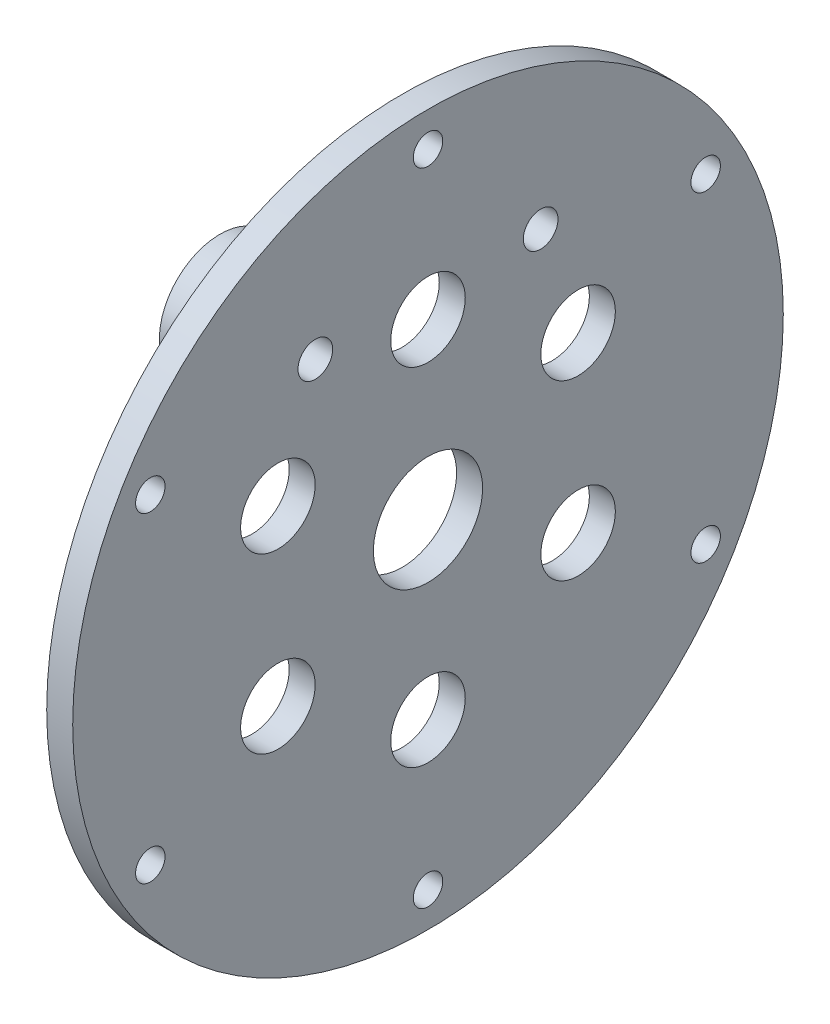
ISO-10303-21;
HEADER;
FILE_DESCRIPTION(('STEP AP214'),'2;1');
FILE_NAME('part.step','',(''),(''),'','','');
FILE_SCHEMA(('AUTOMOTIVE_DESIGN { 1 0 10303 214 1 1 1 1 }'));
ENDSEC;
DATA;
#1=APPLICATION_CONTEXT('core data for automotive mechanical design processes');
#2=APPLICATION_PROTOCOL_DEFINITION('international standard','automotive_design',2000,#1);
#3=PRODUCT_CONTEXT('',#1,'mechanical');
#4=PRODUCT('Part','Part','',(#3));
#5=PRODUCT_RELATED_PRODUCT_CATEGORY('part','',(#4));
#6=PRODUCT_DEFINITION_FORMATION('','',#4);
#7=PRODUCT_DEFINITION_CONTEXT('part definition',#1,'design');
#8=PRODUCT_DEFINITION('design','',#6,#7);
#9=PRODUCT_DEFINITION_SHAPE('','',#8);
#10=(LENGTH_UNIT() NAMED_UNIT(*) SI_UNIT(.MILLI.,.METRE.));
#11=(NAMED_UNIT(*) PLANE_ANGLE_UNIT() SI_UNIT($,.RADIAN.));
#12=(NAMED_UNIT(*) SI_UNIT($,.STERADIAN.) SOLID_ANGLE_UNIT());
#13=UNCERTAINTY_MEASURE_WITH_UNIT(LENGTH_MEASURE(1.E-05),#10,'distance_accuracy_value','');
#14=(GEOMETRIC_REPRESENTATION_CONTEXT(3) GLOBAL_UNCERTAINTY_ASSIGNED_CONTEXT((#13)) GLOBAL_UNIT_ASSIGNED_CONTEXT((#10,
#11,#12)) REPRESENTATION_CONTEXT('',''));
#15=CARTESIAN_POINT('',(0.,0.,0.));
#16=DIRECTION('',(0.,0.,1.));
#17=DIRECTION('',(1.,0.,0.));
#18=AXIS2_PLACEMENT_3D('',#15,#16,#17);
#19=CARTESIAN_POINT('',(-3.,41.,0.));
#20=DIRECTION('',(1.,0.,0.));
#21=DIRECTION('',(0.,0.,-1.));
#22=AXIS2_PLACEMENT_3D('',#19,#20,#21);
#23=PLANE('',#22);
#24=CARTESIAN_POINT('',(-3.,37.,0.));
#25=DIRECTION('',(1.,0.,0.));
#26=DIRECTION('',(0.,0.,-1.));
#27=AXIS2_PLACEMENT_3D('',#24,#25,#26);
#28=CIRCLE('',#27,1.7);
#29=CARTESIAN_POINT('',(-3.,37.,-1.7));
#30=VERTEX_POINT('',#29);
#31=EDGE_CURVE('E96',#30,#30,#28,.T.);
#32=ORIENTED_EDGE('',*,*,#31,.T.);
#33=EDGE_LOOP('',(#32));
#34=FACE_BOUND('',#33,.T.);
#35=CARTESIAN_POINT('',(-3.,18.5,-32.0429399400242));
#36=DIRECTION('',(1.,0.,0.));
#37=DIRECTION('',(0.,0.,-1.));
#38=AXIS2_PLACEMENT_3D('',#35,#36,#37);
#39=CIRCLE('',#38,1.7);
#40=CARTESIAN_POINT('',(-3.,18.5,-33.7429399400242));
#41=VERTEX_POINT('',#40);
#42=EDGE_CURVE('E80',#41,#41,#39,.T.);
#43=ORIENTED_EDGE('',*,*,#42,.T.);
#44=EDGE_LOOP('',(#43));
#45=FACE_BOUND('',#44,.T.);
#46=CARTESIAN_POINT('',(-3.,-18.5,-32.0429399400242));
#47=DIRECTION('',(1.,0.,0.));
#48=DIRECTION('',(0.,0.,-1.));
#49=AXIS2_PLACEMENT_3D('',#46,#47,#48);
#50=CIRCLE('',#49,1.7);
#51=CARTESIAN_POINT('',(-3.,-18.5,-33.7429399400242));
#52=VERTEX_POINT('',#51);
#53=EDGE_CURVE('E105',#52,#52,#50,.T.);
#54=ORIENTED_EDGE('',*,*,#53,.T.);
#55=EDGE_LOOP('',(#54));
#56=FACE_BOUND('',#55,.T.);
#57=CARTESIAN_POINT('',(-3.,-37.,0.));
#58=DIRECTION('',(1.,0.,0.));
#59=DIRECTION('',(0.,0.,-1.));
#60=AXIS2_PLACEMENT_3D('',#57,#58,#59);
#61=CIRCLE('',#60,1.7);
#62=CARTESIAN_POINT('',(-3.,-37.,-1.7));
#63=VERTEX_POINT('',#62);
#64=EDGE_CURVE('E125',#63,#63,#61,.T.);
#65=ORIENTED_EDGE('',*,*,#64,.T.);
#66=EDGE_LOOP('',(#65));
#67=FACE_BOUND('',#66,.T.);
#68=CARTESIAN_POINT('',(-3.,-18.5,32.0429399400242));
#69=DIRECTION('',(1.,0.,0.));
#70=DIRECTION('',(0.,0.,-1.));
#71=AXIS2_PLACEMENT_3D('',#68,#69,#70);
#72=CIRCLE('',#71,1.7);
#73=CARTESIAN_POINT('',(-3.,-18.5,30.3429399400242));
#74=VERTEX_POINT('',#73);
#75=EDGE_CURVE('E119',#74,#74,#72,.T.);
#76=ORIENTED_EDGE('',*,*,#75,.T.);
#77=EDGE_LOOP('',(#76));
#78=FACE_BOUND('',#77,.T.);
#79=CARTESIAN_POINT('',(-3.,18.5,32.0429399400242));
#80=DIRECTION('',(1.,0.,0.));
#81=DIRECTION('',(0.,0.,-1.));
#82=AXIS2_PLACEMENT_3D('',#79,#80,#81);
#83=CIRCLE('',#82,1.7);
#84=CARTESIAN_POINT('',(-3.,18.5,30.3429399400242));
#85=VERTEX_POINT('',#84);
#86=EDGE_CURVE('E111',#85,#85,#83,.T.);
#87=ORIENTED_EDGE('',*,*,#86,.T.);
#88=EDGE_LOOP('',(#87));
#89=FACE_BOUND('',#88,.T.);
#90=CARTESIAN_POINT('',(-3.,10.,-17.3205080756888));
#91=DIRECTION('',(1.,0.,0.));
#92=DIRECTION('',(0.,0.,-1.));
#93=AXIS2_PLACEMENT_3D('',#90,#91,#92);
#94=CIRCLE('',#93,4.3);
#95=CARTESIAN_POINT('',(-3.,10.,-21.6205080756888));
#96=VERTEX_POINT('',#95);
#97=EDGE_CURVE('E95',#96,#96,#94,.T.);
#98=ORIENTED_EDGE('',*,*,#97,.T.);
#99=EDGE_LOOP('',(#98));
#100=FACE_BOUND('',#99,.T.);
#101=CARTESIAN_POINT('',(-3.,-10.,-17.3205080756888));
#102=DIRECTION('',(1.,0.,0.));
#103=DIRECTION('',(0.,0.,-1.));
#104=AXIS2_PLACEMENT_3D('',#101,#102,#103);
#105=CIRCLE('',#104,4.3);
#106=CARTESIAN_POINT('',(-3.,-10.,-21.6205080756888));
#107=VERTEX_POINT('',#106);
#108=EDGE_CURVE('E173',#107,#107,#105,.T.);
#109=ORIENTED_EDGE('',*,*,#108,.T.);
#110=EDGE_LOOP('',(#109));
#111=FACE_BOUND('',#110,.T.);
#112=CARTESIAN_POINT('',(-3.,-20.,0.));
#113=DIRECTION('',(1.,0.,0.));
#114=DIRECTION('',(0.,0.,-1.));
#115=AXIS2_PLACEMENT_3D('',#112,#113,#114);
#116=CIRCLE('',#115,4.3);
#117=CARTESIAN_POINT('',(-3.,-20.,-4.3));
#118=VERTEX_POINT('',#117);
#119=EDGE_CURVE('E165',#118,#118,#116,.T.);
#120=ORIENTED_EDGE('',*,*,#119,.T.);
#121=EDGE_LOOP('',(#120));
#122=FACE_BOUND('',#121,.T.);
#123=CARTESIAN_POINT('',(-3.,-10.,17.3205080756888));
#124=DIRECTION('',(1.,0.,0.));
#125=DIRECTION('',(0.,0.,-1.));
#126=AXIS2_PLACEMENT_3D('',#123,#124,#125);
#127=CIRCLE('',#126,4.3);
#128=CARTESIAN_POINT('',(-3.,-10.,13.0205080756888));
#129=VERTEX_POINT('',#128);
#130=EDGE_CURVE('E157',#129,#129,#127,.T.);
#131=ORIENTED_EDGE('',*,*,#130,.T.);
#132=EDGE_LOOP('',(#131));
#133=FACE_BOUND('',#132,.T.);
#134=CARTESIAN_POINT('',(-3.,10.,17.3205080756888));
#135=DIRECTION('',(1.,0.,0.));
#136=DIRECTION('',(0.,0.,-1.));
#137=AXIS2_PLACEMENT_3D('',#134,#135,#136);
#138=CIRCLE('',#137,4.3);
#139=CARTESIAN_POINT('',(-3.,10.,13.0205080756888));
#140=VERTEX_POINT('',#139);
#141=EDGE_CURVE('E149',#140,#140,#138,.T.);
#142=ORIENTED_EDGE('',*,*,#141,.T.);
#143=EDGE_LOOP('',(#142));
#144=FACE_BOUND('',#143,.T.);
#145=CARTESIAN_POINT('',(-3.,20.,0.));
#146=DIRECTION('',(1.,0.,0.));
#147=DIRECTION('',(0.,0.,-1.));
#148=AXIS2_PLACEMENT_3D('',#145,#146,#147);
#149=CIRCLE('',#148,4.3);
#150=CARTESIAN_POINT('',(-3.,20.,-4.3));
#151=VERTEX_POINT('',#150);
#152=EDGE_CURVE('E141',#151,#151,#149,.T.);
#153=ORIENTED_EDGE('',*,*,#152,.T.);
#154=EDGE_LOOP('',(#153));
#155=FACE_BOUND('',#154,.T.);
#156=CARTESIAN_POINT('',(-3.,0.,0.));
#157=DIRECTION('',(1.,0.,0.));
#158=DIRECTION('',(0.,0.,-1.));
#159=AXIS2_PLACEMENT_3D('',#156,#157,#158);
#160=CIRCLE('',#159,6.3);
#161=CARTESIAN_POINT('',(-3.,0.,-6.3));
#162=VERTEX_POINT('',#161);
#163=EDGE_CURVE('E140',#162,#162,#160,.T.);
#164=ORIENTED_EDGE('',*,*,#163,.T.);
#165=EDGE_LOOP('',(#164));
#166=FACE_BOUND('',#165,.T.);
#167=CARTESIAN_POINT('',(-3.,22.5166604983954,-13.));
#168=DIRECTION('',(1.,0.,0.));
#169=DIRECTION('',(0.,0.,-1.));
#170=AXIS2_PLACEMENT_3D('',#167,#168,#169);
#171=CIRCLE('',#170,7.);
#172=CARTESIAN_POINT('',(-3.,22.5166604983954,-20.));
#173=VERTEX_POINT('',#172);
#174=EDGE_CURVE('E10',#173,#173,#171,.F.);
#175=ORIENTED_EDGE('',*,*,#174,.F.);
#176=EDGE_LOOP('',(#175));
#177=FACE_BOUND('',#176,.T.);
#178=CARTESIAN_POINT('',(-3.,22.5166604983954,13.));
#179=DIRECTION('',(1.,0.,0.));
#180=DIRECTION('',(0.,0.,-1.));
#181=AXIS2_PLACEMENT_3D('',#178,#179,#180);
#182=CIRCLE('',#181,7.);
#183=CARTESIAN_POINT('',(-3.,22.5166604983954,6.));
#184=VERTEX_POINT('',#183);
#185=EDGE_CURVE('E43',#184,#184,#182,.F.);
#186=ORIENTED_EDGE('',*,*,#185,.F.);
#187=EDGE_LOOP('',(#186));
#188=FACE_BOUND('',#187,.T.);
#189=CARTESIAN_POINT('',(-3.,0.,0.));
#190=DIRECTION('',(-1.,0.,0.));
#191=DIRECTION('',(0.,0.,1.));
#192=AXIS2_PLACEMENT_3D('',#189,#190,#191);
#193=CIRCLE('',#192,41.);
#194=CARTESIAN_POINT('',(-3.,0.,41.));
#195=VERTEX_POINT('',#194);
#196=EDGE_CURVE('E198',#195,#195,#193,.T.);
#197=ORIENTED_EDGE('',*,*,#196,.T.);
#198=EDGE_LOOP('',(#197));
#199=FACE_BOUND('',#198,.T.);
#200=ADVANCED_FACE('F35',(#34,#45,#56,#67,#78,#89,#100,#111,#122,#133,#144,#155,#166,#177,#188,
#199),#23,.F.);
#201=CARTESIAN_POINT('',(0.,0.,0.));
#202=DIRECTION('',(-1.,0.,0.));
#203=DIRECTION('',(0.,0.,1.));
#204=AXIS2_PLACEMENT_3D('',#201,#202,#203);
#205=PLANE('',#204);
#206=CARTESIAN_POINT('',(0.,22.5166604983954,13.));
#207=DIRECTION('',(1.,0.,0.));
#208=DIRECTION('',(0.,0.,-1.));
#209=AXIS2_PLACEMENT_3D('',#206,#207,#208);
#210=CIRCLE('',#209,2.);
#211=CARTESIAN_POINT('',(0.,22.5166604983954,11.));
#212=VERTEX_POINT('',#211);
#213=EDGE_CURVE('E57',#212,#212,#210,.T.);
#214=ORIENTED_EDGE('',*,*,#213,.F.);
#215=EDGE_LOOP('',(#214));
#216=FACE_BOUND('',#215,.T.);
#217=CARTESIAN_POINT('',(0.,22.5166604983954,-13.));
#218=DIRECTION('',(1.,0.,0.));
#219=DIRECTION('',(0.,0.,-1.));
#220=AXIS2_PLACEMENT_3D('',#217,#218,#219);
#221=CIRCLE('',#220,2.);
#222=CARTESIAN_POINT('',(0.,22.5166604983954,-15.));
#223=VERTEX_POINT('',#222);
#224=EDGE_CURVE('E66',#223,#223,#221,.T.);
#225=ORIENTED_EDGE('',*,*,#224,.F.);
#226=EDGE_LOOP('',(#225));
#227=FACE_BOUND('',#226,.T.);
#228=CARTESIAN_POINT('',(0.,37.,0.));
#229=DIRECTION('',(1.,0.,0.));
#230=DIRECTION('',(0.,0.,-1.));
#231=AXIS2_PLACEMENT_3D('',#228,#229,#230);
#232=CIRCLE('',#231,1.7);
#233=CARTESIAN_POINT('',(0.,37.,-1.7));
#234=VERTEX_POINT('',#233);
#235=EDGE_CURVE('E91',#234,#234,#232,.T.);
#236=ORIENTED_EDGE('',*,*,#235,.F.);
#237=EDGE_LOOP('',(#236));
#238=FACE_BOUND('',#237,.T.);
#239=CARTESIAN_POINT('',(0.,18.5,-32.0429399400242));
#240=DIRECTION('',(1.,0.,0.));
#241=DIRECTION('',(0.,0.,-1.));
#242=AXIS2_PLACEMENT_3D('',#239,#240,#241);
#243=CIRCLE('',#242,1.7);
#244=CARTESIAN_POINT('',(0.,18.5,-33.7429399400242));
#245=VERTEX_POINT('',#244);
#246=EDGE_CURVE('E101',#245,#245,#243,.T.);
#247=ORIENTED_EDGE('',*,*,#246,.F.);
#248=EDGE_LOOP('',(#247));
#249=FACE_BOUND('',#248,.T.);
#250=CARTESIAN_POINT('',(0.,-18.5,-32.0429399400242));
#251=DIRECTION('',(1.,0.,0.));
#252=DIRECTION('',(0.,0.,-1.));
#253=AXIS2_PLACEMENT_3D('',#250,#251,#252);
#254=CIRCLE('',#253,1.7);
#255=CARTESIAN_POINT('',(0.,-18.5,-33.7429399400242));
#256=VERTEX_POINT('',#255);
#257=EDGE_CURVE('E129',#256,#256,#254,.T.);
#258=ORIENTED_EDGE('',*,*,#257,.F.);
#259=EDGE_LOOP('',(#258));
#260=FACE_BOUND('',#259,.T.);
#261=CARTESIAN_POINT('',(0.,-37.,0.));
#262=DIRECTION('',(1.,0.,0.));
#263=DIRECTION('',(0.,0.,-1.));
#264=AXIS2_PLACEMENT_3D('',#261,#262,#263);
#265=CIRCLE('',#264,1.7);
#266=CARTESIAN_POINT('',(0.,-37.,-1.7));
#267=VERTEX_POINT('',#266);
#268=EDGE_CURVE('E122',#267,#267,#265,.T.);
#269=ORIENTED_EDGE('',*,*,#268,.F.);
#270=EDGE_LOOP('',(#269));
#271=FACE_BOUND('',#270,.T.);
#272=CARTESIAN_POINT('',(0.,-18.5,32.0429399400242));
#273=DIRECTION('',(1.,0.,0.));
#274=DIRECTION('',(0.,0.,-1.));
#275=AXIS2_PLACEMENT_3D('',#272,#273,#274);
#276=CIRCLE('',#275,1.7);
#277=CARTESIAN_POINT('',(0.,-18.5,30.3429399400242));
#278=VERTEX_POINT('',#277);
#279=EDGE_CURVE('E115',#278,#278,#276,.T.);
#280=ORIENTED_EDGE('',*,*,#279,.F.);
#281=EDGE_LOOP('',(#280));
#282=FACE_BOUND('',#281,.T.);
#283=CARTESIAN_POINT('',(0.,18.5,32.0429399400242));
#284=DIRECTION('',(1.,0.,0.));
#285=DIRECTION('',(0.,0.,-1.));
#286=AXIS2_PLACEMENT_3D('',#283,#284,#285);
#287=CIRCLE('',#286,1.7);
#288=CARTESIAN_POINT('',(0.,18.5,30.3429399400242));
#289=VERTEX_POINT('',#288);
#290=EDGE_CURVE('E100',#289,#289,#287,.T.);
#291=ORIENTED_EDGE('',*,*,#290,.F.);
#292=EDGE_LOOP('',(#291));
#293=FACE_BOUND('',#292,.T.);
#294=CARTESIAN_POINT('',(0.,10.,-17.3205080756888));
#295=DIRECTION('',(1.,0.,0.));
#296=DIRECTION('',(0.,0.,-1.));
#297=AXIS2_PLACEMENT_3D('',#294,#295,#296);
#298=CIRCLE('',#297,4.3);
#299=CARTESIAN_POINT('',(0.,10.,-21.6205080756888));
#300=VERTEX_POINT('',#299);
#301=EDGE_CURVE('E177',#300,#300,#298,.T.);
#302=ORIENTED_EDGE('',*,*,#301,.F.);
#303=EDGE_LOOP('',(#302));
#304=FACE_BOUND('',#303,.T.);
#305=CARTESIAN_POINT('',(0.,-10.,-17.3205080756888));
#306=DIRECTION('',(1.,0.,0.));
#307=DIRECTION('',(0.,0.,-1.));
#308=AXIS2_PLACEMENT_3D('',#305,#306,#307);
#309=CIRCLE('',#308,4.3);
#310=CARTESIAN_POINT('',(0.,-10.,-21.6205080756888));
#311=VERTEX_POINT('',#310);
#312=EDGE_CURVE('E169',#311,#311,#309,.T.);
#313=ORIENTED_EDGE('',*,*,#312,.F.);
#314=EDGE_LOOP('',(#313));
#315=FACE_BOUND('',#314,.T.);
#316=CARTESIAN_POINT('',(0.,-20.,0.));
#317=DIRECTION('',(1.,0.,0.));
#318=DIRECTION('',(0.,0.,-1.));
#319=AXIS2_PLACEMENT_3D('',#316,#317,#318);
#320=CIRCLE('',#319,4.3);
#321=CARTESIAN_POINT('',(0.,-20.,-4.3));
#322=VERTEX_POINT('',#321);
#323=EDGE_CURVE('E161',#322,#322,#320,.T.);
#324=ORIENTED_EDGE('',*,*,#323,.F.);
#325=EDGE_LOOP('',(#324));
#326=FACE_BOUND('',#325,.T.);
#327=CARTESIAN_POINT('',(0.,-10.,17.3205080756888));
#328=DIRECTION('',(1.,0.,0.));
#329=DIRECTION('',(0.,0.,-1.));
#330=AXIS2_PLACEMENT_3D('',#327,#328,#329);
#331=CIRCLE('',#330,4.3);
#332=CARTESIAN_POINT('',(0.,-10.,13.0205080756888));
#333=VERTEX_POINT('',#332);
#334=EDGE_CURVE('E153',#333,#333,#331,.T.);
#335=ORIENTED_EDGE('',*,*,#334,.F.);
#336=EDGE_LOOP('',(#335));
#337=FACE_BOUND('',#336,.T.);
#338=CARTESIAN_POINT('',(0.,10.,17.3205080756888));
#339=DIRECTION('',(1.,0.,0.));
#340=DIRECTION('',(0.,0.,-1.));
#341=AXIS2_PLACEMENT_3D('',#338,#339,#340);
#342=CIRCLE('',#341,4.3);
#343=CARTESIAN_POINT('',(0.,10.,13.0205080756888));
#344=VERTEX_POINT('',#343);
#345=EDGE_CURVE('E145',#344,#344,#342,.T.);
#346=ORIENTED_EDGE('',*,*,#345,.F.);
#347=EDGE_LOOP('',(#346));
#348=FACE_BOUND('',#347,.T.);
#349=CARTESIAN_POINT('',(0.,20.,0.));
#350=DIRECTION('',(1.,0.,0.));
#351=DIRECTION('',(0.,0.,-1.));
#352=AXIS2_PLACEMENT_3D('',#349,#350,#351);
#353=CIRCLE('',#352,4.3);
#354=CARTESIAN_POINT('',(0.,20.,-4.3));
#355=VERTEX_POINT('',#354);
#356=EDGE_CURVE('E136',#355,#355,#353,.T.);
#357=ORIENTED_EDGE('',*,*,#356,.F.);
#358=EDGE_LOOP('',(#357));
#359=FACE_BOUND('',#358,.T.);
#360=CARTESIAN_POINT('',(0.,0.,0.));
#361=DIRECTION('',(1.,0.,0.));
#362=DIRECTION('',(0.,0.,-1.));
#363=AXIS2_PLACEMENT_3D('',#360,#361,#362);
#364=CIRCLE('',#363,6.3);
#365=CARTESIAN_POINT('',(0.,0.,-6.3));
#366=VERTEX_POINT('',#365);
#367=EDGE_CURVE('E184',#366,#366,#364,.T.);
#368=ORIENTED_EDGE('',*,*,#367,.F.);
#369=EDGE_LOOP('',(#368));
#370=FACE_BOUND('',#369,.T.);
#371=CARTESIAN_POINT('',(0.,0.,0.));
#372=DIRECTION('',(-1.,0.,0.));
#373=DIRECTION('',(0.,0.,1.));
#374=AXIS2_PLACEMENT_3D('',#371,#372,#373);
#375=CIRCLE('',#374,41.);
#376=CARTESIAN_POINT('',(0.,0.,41.));
#377=VERTEX_POINT('',#376);
#378=EDGE_CURVE('E51',#377,#377,#375,.T.);
#379=ORIENTED_EDGE('',*,*,#378,.F.);
#380=EDGE_LOOP('',(#379));
#381=FACE_BOUND('',#380,.T.);
#382=ADVANCED_FACE('F207',(#216,#227,#238,#249,#260,#271,#282,#293,#304,#315,#326,#337,#348,
#359,#370,#381),#205,.F.);
#383=CARTESIAN_POINT('',(-60.,0.,0.));
#384=DIRECTION('',(-1.,0.,0.));
#385=DIRECTION('',(0.,0.,1.));
#386=AXIS2_PLACEMENT_3D('',#383,#384,#385);
#387=CYLINDRICAL_SURFACE('',#386,41.);
#388=ORIENTED_EDGE('',*,*,#196,.F.);
#389=EDGE_LOOP('',(#388));
#390=FACE_BOUND('',#389,.T.);
#391=ORIENTED_EDGE('',*,*,#378,.T.);
#392=EDGE_LOOP('',(#391));
#393=FACE_BOUND('',#392,.T.);
#394=ADVANCED_FACE('F205',(#390,#393),#387,.T.);
#395=CARTESIAN_POINT('',(-3.,22.5166604983954,13.));
#396=DIRECTION('',(-1.,0.,0.));
#397=DIRECTION('',(0.,0.,1.));
#398=AXIS2_PLACEMENT_3D('',#395,#396,#397);
#399=CYLINDRICAL_SURFACE('',#398,7.);
#400=ORIENTED_EDGE('',*,*,#185,.T.);
#401=EDGE_LOOP('',(#400));
#402=FACE_BOUND('',#401,.T.);
#403=CARTESIAN_POINT('',(-11.,22.5166604983954,13.));
#404=DIRECTION('',(1.,0.,0.));
#405=DIRECTION('',(0.,0.,-1.));
#406=AXIS2_PLACEMENT_3D('',#403,#404,#405);
#407=CIRCLE('',#406,7.);
#408=CARTESIAN_POINT('',(-11.,22.5166604983954,6.));
#409=VERTEX_POINT('',#408);
#410=EDGE_CURVE('E195',#409,#409,#407,.T.);
#411=ORIENTED_EDGE('',*,*,#410,.T.);
#412=EDGE_LOOP('',(#411));
#413=FACE_BOUND('',#412,.T.);
#414=ADVANCED_FACE('F214',(#402,#413),#399,.T.);
#415=CARTESIAN_POINT('',(-11.,22.5166604983954,13.));
#416=DIRECTION('',(1.,0.,0.));
#417=DIRECTION('',(0.,0.,-1.));
#418=AXIS2_PLACEMENT_3D('',#415,#416,#417);
#419=PLANE('',#418);
#420=CARTESIAN_POINT('',(-11.,22.5166604983954,13.));
#421=DIRECTION('',(1.,0.,0.));
#422=DIRECTION('',(0.,0.,-1.));
#423=AXIS2_PLACEMENT_3D('',#420,#421,#422);
#424=CIRCLE('',#423,4.4);
#425=CARTESIAN_POINT('',(-11.,22.5166604983954,8.6));
#426=VERTEX_POINT('',#425);
#427=EDGE_CURVE('E81',#426,#426,#424,.T.);
#428=ORIENTED_EDGE('',*,*,#427,.T.);
#429=EDGE_LOOP('',(#428));
#430=FACE_BOUND('',#429,.T.);
#431=ORIENTED_EDGE('',*,*,#410,.F.);
#432=EDGE_LOOP('',(#431));
#433=FACE_BOUND('',#432,.T.);
#434=ADVANCED_FACE('F222',(#430,#433),#419,.F.);
#435=CARTESIAN_POINT('',(-3.,22.5166604983954,-13.));
#436=DIRECTION('',(-1.,0.,0.));
#437=DIRECTION('',(0.,0.,1.));
#438=AXIS2_PLACEMENT_3D('',#435,#436,#437);
#439=CYLINDRICAL_SURFACE('',#438,7.);
#440=ORIENTED_EDGE('',*,*,#174,.T.);
#441=EDGE_LOOP('',(#440));
#442=FACE_BOUND('',#441,.T.);
#443=CARTESIAN_POINT('',(-11.,22.5166604983954,-13.));
#444=DIRECTION('',(1.,0.,0.));
#445=DIRECTION('',(0.,0.,-1.));
#446=AXIS2_PLACEMENT_3D('',#443,#444,#445);
#447=CIRCLE('',#446,7.);
#448=CARTESIAN_POINT('',(-11.,22.5166604983954,-20.));
#449=VERTEX_POINT('',#448);
#450=EDGE_CURVE('E188',#449,#449,#447,.T.);
#451=ORIENTED_EDGE('',*,*,#450,.T.);
#452=EDGE_LOOP('',(#451));
#453=FACE_BOUND('',#452,.T.);
#454=ADVANCED_FACE('F226',(#442,#453),#439,.T.);
#455=CARTESIAN_POINT('',(-11.,22.5166604983954,-13.));
#456=DIRECTION('',(1.,0.,0.));
#457=DIRECTION('',(0.,0.,-1.));
#458=AXIS2_PLACEMENT_3D('',#455,#456,#457);
#459=PLANE('',#458);
#460=CARTESIAN_POINT('',(-11.,22.5166604983954,-13.));
#461=DIRECTION('',(1.,0.,0.));
#462=DIRECTION('',(0.,0.,-1.));
#463=AXIS2_PLACEMENT_3D('',#460,#461,#462);
#464=CIRCLE('',#463,4.4);
#465=CARTESIAN_POINT('',(-11.,22.5166604983954,-17.4));
#466=VERTEX_POINT('',#465);
#467=EDGE_CURVE('E63',#466,#466,#464,.T.);
#468=ORIENTED_EDGE('',*,*,#467,.T.);
#469=EDGE_LOOP('',(#468));
#470=FACE_BOUND('',#469,.T.);
#471=ORIENTED_EDGE('',*,*,#450,.F.);
#472=EDGE_LOOP('',(#471));
#473=FACE_BOUND('',#472,.T.);
#474=ADVANCED_FACE('F230',(#470,#473),#459,.F.);
#475=CARTESIAN_POINT('',(0.,0.,0.));
#476=DIRECTION('',(-1.,0.,0.));
#477=DIRECTION('',(0.,0.,1.));
#478=AXIS2_PLACEMENT_3D('',#475,#476,#477);
#479=CYLINDRICAL_SURFACE('',#478,6.3);
#480=ORIENTED_EDGE('',*,*,#367,.T.);
#481=EDGE_LOOP('',(#480));
#482=FACE_BOUND('',#481,.T.);
#483=ORIENTED_EDGE('',*,*,#163,.F.);
#484=EDGE_LOOP('',(#483));
#485=FACE_BOUND('',#484,.T.);
#486=ADVANCED_FACE('F233',(#482,#485),#479,.F.);
#487=CARTESIAN_POINT('',(0.,20.,0.));
#488=DIRECTION('',(-1.,0.,0.));
#489=DIRECTION('',(0.,0.,1.));
#490=AXIS2_PLACEMENT_3D('',#487,#488,#489);
#491=CYLINDRICAL_SURFACE('',#490,4.3);
#492=ORIENTED_EDGE('',*,*,#356,.T.);
#493=EDGE_LOOP('',(#492));
#494=FACE_BOUND('',#493,.T.);
#495=ORIENTED_EDGE('',*,*,#152,.F.);
#496=EDGE_LOOP('',(#495));
#497=FACE_BOUND('',#496,.T.);
#498=ADVANCED_FACE('F237',(#494,#497),#491,.F.);
#499=CARTESIAN_POINT('',(0.,10.,17.3205080756888));
#500=DIRECTION('',(-1.,0.,0.));
#501=DIRECTION('',(0.,0.,1.));
#502=AXIS2_PLACEMENT_3D('',#499,#500,#501);
#503=CYLINDRICAL_SURFACE('',#502,4.3);
#504=ORIENTED_EDGE('',*,*,#345,.T.);
#505=EDGE_LOOP('',(#504));
#506=FACE_BOUND('',#505,.T.);
#507=ORIENTED_EDGE('',*,*,#141,.F.);
#508=EDGE_LOOP('',(#507));
#509=FACE_BOUND('',#508,.T.);
#510=ADVANCED_FACE('F255',(#506,#509),#503,.F.);
#511=CARTESIAN_POINT('',(0.,-10.,17.3205080756888));
#512=DIRECTION('',(-1.,0.,0.));
#513=DIRECTION('',(0.,0.,1.));
#514=AXIS2_PLACEMENT_3D('',#511,#512,#513);
#515=CYLINDRICAL_SURFACE('',#514,4.3);
#516=ORIENTED_EDGE('',*,*,#334,.T.);
#517=EDGE_LOOP('',(#516));
#518=FACE_BOUND('',#517,.T.);
#519=ORIENTED_EDGE('',*,*,#130,.F.);
#520=EDGE_LOOP('',(#519));
#521=FACE_BOUND('',#520,.T.);
#522=ADVANCED_FACE('F251',(#518,#521),#515,.F.);
#523=CARTESIAN_POINT('',(0.,-20.,0.));
#524=DIRECTION('',(-1.,0.,0.));
#525=DIRECTION('',(0.,0.,1.));
#526=AXIS2_PLACEMENT_3D('',#523,#524,#525);
#527=CYLINDRICAL_SURFACE('',#526,4.3);
#528=ORIENTED_EDGE('',*,*,#323,.T.);
#529=EDGE_LOOP('',(#528));
#530=FACE_BOUND('',#529,.T.);
#531=ORIENTED_EDGE('',*,*,#119,.F.);
#532=EDGE_LOOP('',(#531));
#533=FACE_BOUND('',#532,.T.);
#534=ADVANCED_FACE('F247',(#530,#533),#527,.F.);
#535=CARTESIAN_POINT('',(0.,-10.,-17.3205080756888));
#536=DIRECTION('',(-1.,0.,0.));
#537=DIRECTION('',(0.,0.,1.));
#538=AXIS2_PLACEMENT_3D('',#535,#536,#537);
#539=CYLINDRICAL_SURFACE('',#538,4.3);
#540=ORIENTED_EDGE('',*,*,#312,.T.);
#541=EDGE_LOOP('',(#540));
#542=FACE_BOUND('',#541,.T.);
#543=ORIENTED_EDGE('',*,*,#108,.F.);
#544=EDGE_LOOP('',(#543));
#545=FACE_BOUND('',#544,.T.);
#546=ADVANCED_FACE('F243',(#542,#545),#539,.F.);
#547=CARTESIAN_POINT('',(0.,10.,-17.3205080756888));
#548=DIRECTION('',(-1.,0.,0.));
#549=DIRECTION('',(0.,0.,1.));
#550=AXIS2_PLACEMENT_3D('',#547,#548,#549);
#551=CYLINDRICAL_SURFACE('',#550,4.3);
#552=ORIENTED_EDGE('',*,*,#301,.T.);
#553=EDGE_LOOP('',(#552));
#554=FACE_BOUND('',#553,.T.);
#555=ORIENTED_EDGE('',*,*,#97,.F.);
#556=EDGE_LOOP('',(#555));
#557=FACE_BOUND('',#556,.T.);
#558=ADVANCED_FACE('F239',(#554,#557),#551,.F.);
#559=CARTESIAN_POINT('',(0.,18.5,32.0429399400242));
#560=DIRECTION('',(-1.,0.,0.));
#561=DIRECTION('',(0.,0.,1.));
#562=AXIS2_PLACEMENT_3D('',#559,#560,#561);
#563=CYLINDRICAL_SURFACE('',#562,1.7);
#564=ORIENTED_EDGE('',*,*,#290,.T.);
#565=EDGE_LOOP('',(#564));
#566=FACE_BOUND('',#565,.T.);
#567=ORIENTED_EDGE('',*,*,#86,.F.);
#568=EDGE_LOOP('',(#567));
#569=FACE_BOUND('',#568,.T.);
#570=ADVANCED_FACE('F242',(#566,#569),#563,.F.);
#571=CARTESIAN_POINT('',(0.,-18.5,32.0429399400242));
#572=DIRECTION('',(-1.,0.,0.));
#573=DIRECTION('',(0.,0.,1.));
#574=AXIS2_PLACEMENT_3D('',#571,#572,#573);
#575=CYLINDRICAL_SURFACE('',#574,1.7);
#576=ORIENTED_EDGE('',*,*,#279,.T.);
#577=EDGE_LOOP('',(#576));
#578=FACE_BOUND('',#577,.T.);
#579=ORIENTED_EDGE('',*,*,#75,.F.);
#580=EDGE_LOOP('',(#579));
#581=FACE_BOUND('',#580,.T.);
#582=ADVANCED_FACE('F271',(#578,#581),#575,.F.);
#583=CARTESIAN_POINT('',(0.,-37.,0.));
#584=DIRECTION('',(-1.,0.,0.));
#585=DIRECTION('',(0.,0.,1.));
#586=AXIS2_PLACEMENT_3D('',#583,#584,#585);
#587=CYLINDRICAL_SURFACE('',#586,1.7);
#588=ORIENTED_EDGE('',*,*,#268,.T.);
#589=EDGE_LOOP('',(#588));
#590=FACE_BOUND('',#589,.T.);
#591=ORIENTED_EDGE('',*,*,#64,.F.);
#592=EDGE_LOOP('',(#591));
#593=FACE_BOUND('',#592,.T.);
#594=ADVANCED_FACE('F267',(#590,#593),#587,.F.);
#595=CARTESIAN_POINT('',(0.,-18.5,-32.0429399400242));
#596=DIRECTION('',(-1.,0.,0.));
#597=DIRECTION('',(0.,0.,1.));
#598=AXIS2_PLACEMENT_3D('',#595,#596,#597);
#599=CYLINDRICAL_SURFACE('',#598,1.7);
#600=ORIENTED_EDGE('',*,*,#257,.T.);
#601=EDGE_LOOP('',(#600));
#602=FACE_BOUND('',#601,.T.);
#603=ORIENTED_EDGE('',*,*,#53,.F.);
#604=EDGE_LOOP('',(#603));
#605=FACE_BOUND('',#604,.T.);
#606=ADVANCED_FACE('F263',(#602,#605),#599,.F.);
#607=CARTESIAN_POINT('',(0.,18.5,-32.0429399400242));
#608=DIRECTION('',(-1.,0.,0.));
#609=DIRECTION('',(0.,0.,1.));
#610=AXIS2_PLACEMENT_3D('',#607,#608,#609);
#611=CYLINDRICAL_SURFACE('',#610,1.7);
#612=ORIENTED_EDGE('',*,*,#246,.T.);
#613=EDGE_LOOP('',(#612));
#614=FACE_BOUND('',#613,.T.);
#615=ORIENTED_EDGE('',*,*,#42,.F.);
#616=EDGE_LOOP('',(#615));
#617=FACE_BOUND('',#616,.T.);
#618=ADVANCED_FACE('F266',(#614,#617),#611,.F.);
#619=CARTESIAN_POINT('',(0.,37.,0.));
#620=DIRECTION('',(-1.,0.,0.));
#621=DIRECTION('',(0.,0.,1.));
#622=AXIS2_PLACEMENT_3D('',#619,#620,#621);
#623=CYLINDRICAL_SURFACE('',#622,1.7);
#624=ORIENTED_EDGE('',*,*,#235,.T.);
#625=EDGE_LOOP('',(#624));
#626=FACE_BOUND('',#625,.T.);
#627=ORIENTED_EDGE('',*,*,#31,.F.);
#628=EDGE_LOOP('',(#627));
#629=FACE_BOUND('',#628,.T.);
#630=ADVANCED_FACE('F281',(#626,#629),#623,.F.);
#631=CARTESIAN_POINT('',(-4.,22.5166604983954,-13.));
#632=DIRECTION('',(-1.,0.,0.));
#633=DIRECTION('',(0.,0.,1.));
#634=AXIS2_PLACEMENT_3D('',#631,#632,#633);
#635=CYLINDRICAL_SURFACE('',#634,4.4);
#636=CARTESIAN_POINT('',(-4.,22.5166604983954,-13.));
#637=DIRECTION('',(1.,0.,0.));
#638=DIRECTION('',(0.,0.,-1.));
#639=AXIS2_PLACEMENT_3D('',#636,#637,#638);
#640=CIRCLE('',#639,4.4);
#641=CARTESIAN_POINT('',(-4.,22.5166604983954,-17.4));
#642=VERTEX_POINT('',#641);
#643=EDGE_CURVE('E84',#642,#642,#640,.T.);
#644=ORIENTED_EDGE('',*,*,#643,.T.);
#645=EDGE_LOOP('',(#644));
#646=FACE_BOUND('',#645,.T.);
#647=ORIENTED_EDGE('',*,*,#467,.F.);
#648=EDGE_LOOP('',(#647));
#649=FACE_BOUND('',#648,.T.);
#650=ADVANCED_FACE('F285',(#646,#649),#635,.F.);
#651=CARTESIAN_POINT('',(-4.,22.5166604983954,-13.));
#652=DIRECTION('',(1.,0.,0.));
#653=DIRECTION('',(0.,0.,-1.));
#654=AXIS2_PLACEMENT_3D('',#651,#652,#653);
#655=PLANE('',#654);
#656=CARTESIAN_POINT('',(-4.,22.5166604983954,-13.));
#657=DIRECTION('',(1.,0.,0.));
#658=DIRECTION('',(0.,0.,-1.));
#659=AXIS2_PLACEMENT_3D('',#656,#657,#658);
#660=CIRCLE('',#659,2.);
#661=CARTESIAN_POINT('',(-4.,22.5166604983954,-15.));
#662=VERTEX_POINT('',#661);
#663=EDGE_CURVE('E38',#662,#662,#660,.F.);
#664=ORIENTED_EDGE('',*,*,#663,.F.);
#665=EDGE_LOOP('',(#664));
#666=FACE_BOUND('',#665,.T.);
#667=ORIENTED_EDGE('',*,*,#643,.F.);
#668=EDGE_LOOP('',(#667));
#669=FACE_BOUND('',#668,.T.);
#670=ADVANCED_FACE('F289',(#666,#669),#655,.F.);
#671=CARTESIAN_POINT('',(-4.,22.5166604983954,13.));
#672=DIRECTION('',(-1.,0.,0.));
#673=DIRECTION('',(0.,0.,1.));
#674=AXIS2_PLACEMENT_3D('',#671,#672,#673);
#675=CYLINDRICAL_SURFACE('',#674,4.4);
#676=CARTESIAN_POINT('',(-4.,22.5166604983954,13.));
#677=DIRECTION('',(1.,0.,0.));
#678=DIRECTION('',(0.,0.,-1.));
#679=AXIS2_PLACEMENT_3D('',#676,#677,#678);
#680=CIRCLE('',#679,4.4);
#681=CARTESIAN_POINT('',(-4.,22.5166604983954,8.6));
#682=VERTEX_POINT('',#681);
#683=EDGE_CURVE('E76',#682,#682,#680,.T.);
#684=ORIENTED_EDGE('',*,*,#683,.T.);
#685=EDGE_LOOP('',(#684));
#686=FACE_BOUND('',#685,.T.);
#687=ORIENTED_EDGE('',*,*,#427,.F.);
#688=EDGE_LOOP('',(#687));
#689=FACE_BOUND('',#688,.T.);
#690=ADVANCED_FACE('F293',(#686,#689),#675,.F.);
#691=CARTESIAN_POINT('',(-4.,22.5166604983954,13.));
#692=DIRECTION('',(1.,0.,0.));
#693=DIRECTION('',(0.,0.,-1.));
#694=AXIS2_PLACEMENT_3D('',#691,#692,#693);
#695=PLANE('',#694);
#696=CARTESIAN_POINT('',(-4.,22.5166604983954,13.));
#697=DIRECTION('',(1.,0.,0.));
#698=DIRECTION('',(0.,0.,-1.));
#699=AXIS2_PLACEMENT_3D('',#696,#697,#698);
#700=CIRCLE('',#699,2.);
#701=CARTESIAN_POINT('',(-4.,22.5166604983954,11.));
#702=VERTEX_POINT('',#701);
#703=EDGE_CURVE('E54',#702,#702,#700,.F.);
#704=ORIENTED_EDGE('',*,*,#703,.F.);
#705=EDGE_LOOP('',(#704));
#706=FACE_BOUND('',#705,.T.);
#707=ORIENTED_EDGE('',*,*,#683,.F.);
#708=EDGE_LOOP('',(#707));
#709=FACE_BOUND('',#708,.T.);
#710=ADVANCED_FACE('F297',(#706,#709),#695,.F.);
#711=CARTESIAN_POINT('',(0.,22.5166604983954,13.));
#712=DIRECTION('',(-1.,0.,0.));
#713=DIRECTION('',(0.,0.,1.));
#714=AXIS2_PLACEMENT_3D('',#711,#712,#713);
#715=CYLINDRICAL_SURFACE('',#714,2.);
#716=ORIENTED_EDGE('',*,*,#213,.T.);
#717=EDGE_LOOP('',(#716));
#718=FACE_BOUND('',#717,.T.);
#719=ORIENTED_EDGE('',*,*,#703,.T.);
#720=EDGE_LOOP('',(#719));
#721=FACE_BOUND('',#720,.T.);
#722=ADVANCED_FACE('F301',(#718,#721),#715,.F.);
#723=CARTESIAN_POINT('',(0.,22.5166604983954,-13.));
#724=DIRECTION('',(-1.,0.,0.));
#725=DIRECTION('',(0.,0.,1.));
#726=AXIS2_PLACEMENT_3D('',#723,#724,#725);
#727=CYLINDRICAL_SURFACE('',#726,2.);
#728=ORIENTED_EDGE('',*,*,#224,.T.);
#729=EDGE_LOOP('',(#728));
#730=FACE_BOUND('',#729,.T.);
#731=ORIENTED_EDGE('',*,*,#663,.T.);
#732=EDGE_LOOP('',(#731));
#733=FACE_BOUND('',#732,.T.);
#734=ADVANCED_FACE('F303',(#730,#733),#727,.F.);
#735=CLOSED_SHELL('',(#200,#382,#394,#414,#434,#454,#474,#486,#498,#510,#522,#534,#546,#558,
#570,#582,#594,#606,#618,#630,#650,#670,#690,#710,#722,#734));
#736=MANIFOLD_SOLID_BREP('B2',#735);
#737=ADVANCED_BREP_SHAPE_REPRESENTATION('',(#18,#736),#14);
#738=SHAPE_DEFINITION_REPRESENTATION(#9,#737);
ENDSEC;
END-ISO-10303-21;
